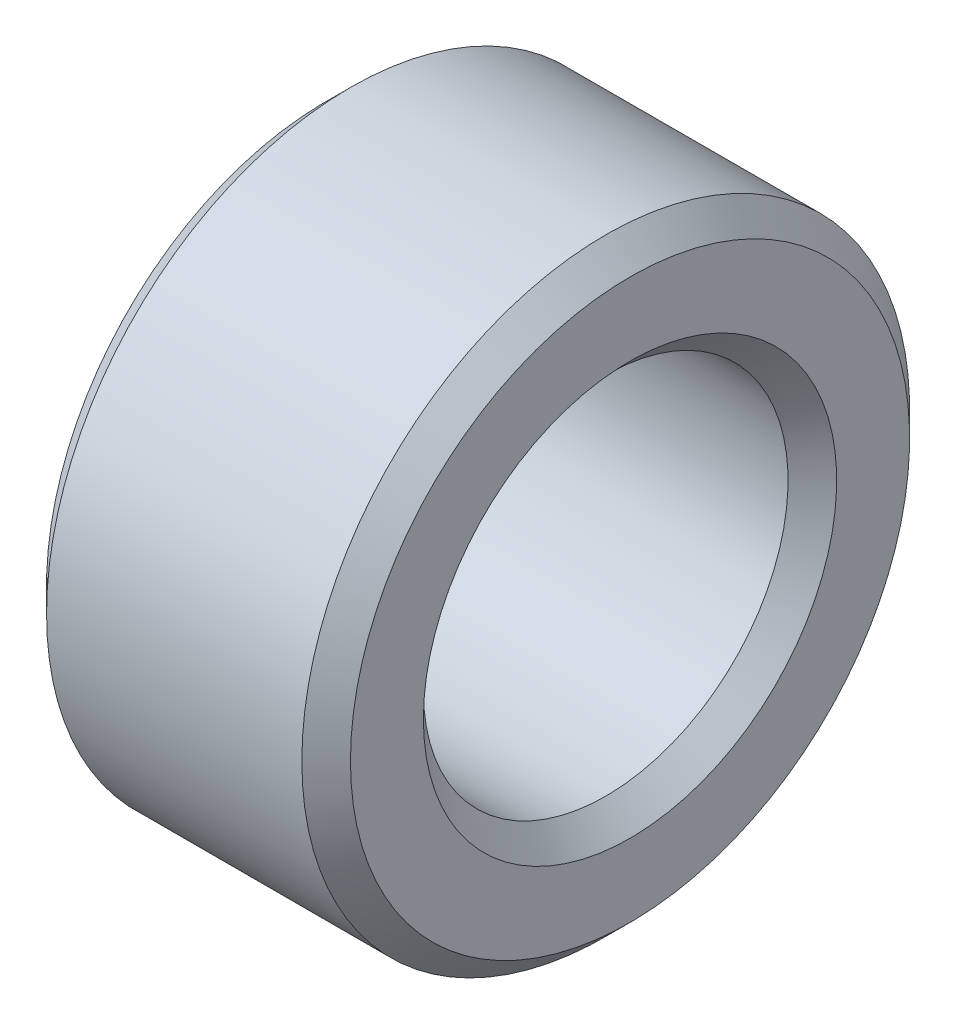
ISO-10303-21;
HEADER;
FILE_DESCRIPTION(('STEP AP214'),'2;1');
FILE_NAME('part.step','',(''),(''),'','','');
FILE_SCHEMA(('AUTOMOTIVE_DESIGN { 1 0 10303 214 1 1 1 1 }'));
ENDSEC;
DATA;
#1=APPLICATION_CONTEXT('core data for automotive mechanical design processes');
#2=APPLICATION_PROTOCOL_DEFINITION('international standard','automotive_design',2000,#1);
#3=PRODUCT_CONTEXT('',#1,'mechanical');
#4=PRODUCT('Part','Part','',(#3));
#5=PRODUCT_RELATED_PRODUCT_CATEGORY('part','',(#4));
#6=PRODUCT_DEFINITION_FORMATION('','',#4);
#7=PRODUCT_DEFINITION_CONTEXT('part definition',#1,'design');
#8=PRODUCT_DEFINITION('design','',#6,#7);
#9=PRODUCT_DEFINITION_SHAPE('','',#8);
#10=(LENGTH_UNIT() NAMED_UNIT(*) SI_UNIT(.MILLI.,.METRE.));
#11=(NAMED_UNIT(*) PLANE_ANGLE_UNIT() SI_UNIT($,.RADIAN.));
#12=(NAMED_UNIT(*) SI_UNIT($,.STERADIAN.) SOLID_ANGLE_UNIT());
#13=UNCERTAINTY_MEASURE_WITH_UNIT(LENGTH_MEASURE(1.E-05),#10,'distance_accuracy_value','');
#14=(GEOMETRIC_REPRESENTATION_CONTEXT(3) GLOBAL_UNCERTAINTY_ASSIGNED_CONTEXT((#13)) GLOBAL_UNIT_ASSIGNED_CONTEXT((#10,
#11,#12)) REPRESENTATION_CONTEXT('',''));
#15=CARTESIAN_POINT('',(0.,0.,0.));
#16=DIRECTION('',(0.,0.,1.));
#17=DIRECTION('',(1.,0.,0.));
#18=AXIS2_PLACEMENT_3D('',#15,#16,#17);
#19=CARTESIAN_POINT('',(0.,1.5,0.));
#20=DIRECTION('',(1.,0.,0.));
#21=DIRECTION('',(0.,0.,-1.));
#22=AXIS2_PLACEMENT_3D('',#19,#20,#21);
#23=PLANE('',#22);
#24=CARTESIAN_POINT('',(0.,0.,0.));
#25=DIRECTION('',(1.,0.,0.));
#26=DIRECTION('',(0.,0.,-1.));
#27=AXIS2_PLACEMENT_3D('',#24,#25,#26);
#28=CIRCLE('',#27,1.7);
#29=CARTESIAN_POINT('',(0.,0.,-1.7));
#30=VERTEX_POINT('',#29);
#31=EDGE_CURVE('E51',#30,#30,#28,.T.);
#32=ORIENTED_EDGE('',*,*,#31,.T.);
#33=EDGE_LOOP('',(#32));
#34=FACE_BOUND('',#33,.T.);
#35=CARTESIAN_POINT('',(0.,0.,0.));
#36=DIRECTION('',(1.,0.,0.));
#37=DIRECTION('',(0.,0.,-1.));
#38=AXIS2_PLACEMENT_3D('',#35,#36,#37);
#39=CIRCLE('',#38,2.3);
#40=CARTESIAN_POINT('',(0.,0.,-2.3));
#41=VERTEX_POINT('',#40);
#42=EDGE_CURVE('E54',#41,#41,#39,.F.);
#43=ORIENTED_EDGE('',*,*,#42,.T.);
#44=EDGE_LOOP('',(#43));
#45=FACE_BOUND('',#44,.T.);
#46=ADVANCED_FACE('F31',(#34,#45),#23,.F.);
#47=CARTESIAN_POINT('',(0.,0.,0.));
#48=DIRECTION('',(-1.,0.,0.));
#49=DIRECTION('',(0.,0.,1.));
#50=AXIS2_PLACEMENT_3D('',#47,#48,#49);
#51=CYLINDRICAL_SURFACE('',#50,2.5);
#52=CARTESIAN_POINT('',(0.200000000000001,0.,0.));
#53=DIRECTION('',(1.,0.,0.));
#54=DIRECTION('',(0.,0.,-1.));
#55=AXIS2_PLACEMENT_3D('',#52,#53,#54);
#56=CIRCLE('',#55,2.5);
#57=CARTESIAN_POINT('',(0.200000000000001,0.,-2.5));
#58=VERTEX_POINT('',#57);
#59=EDGE_CURVE('E42',#58,#58,#56,.T.);
#60=ORIENTED_EDGE('',*,*,#59,.T.);
#61=EDGE_LOOP('',(#60));
#62=FACE_BOUND('',#61,.T.);
#63=CARTESIAN_POINT('',(2.3,0.,0.));
#64=DIRECTION('',(-1.,0.,0.));
#65=DIRECTION('',(0.,0.,1.));
#66=AXIS2_PLACEMENT_3D('',#63,#64,#65);
#67=CIRCLE('',#66,2.5);
#68=CARTESIAN_POINT('',(2.3,0.,2.5));
#69=VERTEX_POINT('',#68);
#70=EDGE_CURVE('E46',#69,#69,#67,.T.);
#71=ORIENTED_EDGE('',*,*,#70,.T.);
#72=EDGE_LOOP('',(#71));
#73=FACE_BOUND('',#72,.T.);
#74=ADVANCED_FACE('F79',(#62,#73),#51,.T.);
#75=CARTESIAN_POINT('',(2.5,1.5,0.));
#76=DIRECTION('',(-1.,0.,0.));
#77=DIRECTION('',(0.,0.,1.));
#78=AXIS2_PLACEMENT_3D('',#75,#76,#77);
#79=PLANE('',#78);
#80=CARTESIAN_POINT('',(2.5,0.,0.));
#81=DIRECTION('',(-1.,0.,0.));
#82=DIRECTION('',(0.,0.,1.));
#83=AXIS2_PLACEMENT_3D('',#80,#81,#82);
#84=CIRCLE('',#83,1.7);
#85=CARTESIAN_POINT('',(2.5,0.,1.7));
#86=VERTEX_POINT('',#85);
#87=EDGE_CURVE('E10',#86,#86,#84,.T.);
#88=ORIENTED_EDGE('',*,*,#87,.T.);
#89=EDGE_LOOP('',(#88));
#90=FACE_BOUND('',#89,.T.);
#91=CARTESIAN_POINT('',(2.5,0.,0.));
#92=DIRECTION('',(-1.,0.,0.));
#93=DIRECTION('',(0.,0.,1.));
#94=AXIS2_PLACEMENT_3D('',#91,#92,#93);
#95=CIRCLE('',#94,2.3);
#96=CARTESIAN_POINT('',(2.5,0.,2.3));
#97=VERTEX_POINT('',#96);
#98=EDGE_CURVE('E38',#97,#97,#95,.F.);
#99=ORIENTED_EDGE('',*,*,#98,.T.);
#100=EDGE_LOOP('',(#99));
#101=FACE_BOUND('',#100,.T.);
#102=ADVANCED_FACE('F85',(#90,#101),#79,.F.);
#103=CARTESIAN_POINT('',(0.,0.,0.));
#104=DIRECTION('',(-1.,0.,0.));
#105=DIRECTION('',(0.,0.,1.));
#106=AXIS2_PLACEMENT_3D('',#103,#104,#105);
#107=CYLINDRICAL_SURFACE('',#106,1.5);
#108=CARTESIAN_POINT('',(0.200000000000001,0.,0.));
#109=DIRECTION('',(1.,0.,0.));
#110=DIRECTION('',(0.,0.,-1.));
#111=AXIS2_PLACEMENT_3D('',#108,#109,#110);
#112=CIRCLE('',#111,1.5);
#113=CARTESIAN_POINT('',(0.200000000000001,0.,-1.5));
#114=VERTEX_POINT('',#113);
#115=EDGE_CURVE('E57',#114,#114,#112,.F.);
#116=ORIENTED_EDGE('',*,*,#115,.T.);
#117=EDGE_LOOP('',(#116));
#118=FACE_BOUND('',#117,.T.);
#119=CARTESIAN_POINT('',(2.3,0.,0.));
#120=DIRECTION('',(-1.,0.,0.));
#121=DIRECTION('',(0.,0.,1.));
#122=AXIS2_PLACEMENT_3D('',#119,#120,#121);
#123=CIRCLE('',#122,1.5);
#124=CARTESIAN_POINT('',(2.3,0.,1.5));
#125=VERTEX_POINT('',#124);
#126=EDGE_CURVE('E60',#125,#125,#123,.F.);
#127=ORIENTED_EDGE('',*,*,#126,.T.);
#128=EDGE_LOOP('',(#127));
#129=FACE_BOUND('',#128,.T.);
#130=ADVANCED_FACE('F64',(#118,#129),#107,.F.);
#131=CARTESIAN_POINT('',(0.200000000000001,0.,0.));
#132=DIRECTION('',(-1.,0.,0.));
#133=DIRECTION('',(0.,0.,1.));
#134=AXIS2_PLACEMENT_3D('',#131,#132,#133);
#135=CONICAL_SURFACE('',#134,1.5,0.785398163397451);
#136=ORIENTED_EDGE('',*,*,#31,.F.);
#137=EDGE_LOOP('',(#136));
#138=FACE_BOUND('',#137,.T.);
#139=ORIENTED_EDGE('',*,*,#115,.F.);
#140=EDGE_LOOP('',(#139));
#141=FACE_BOUND('',#140,.T.);
#142=ADVANCED_FACE('F75',(#138,#141),#135,.F.);
#143=CARTESIAN_POINT('',(0.,0.,0.));
#144=DIRECTION('',(1.,0.,0.));
#145=DIRECTION('',(0.,0.,-1.));
#146=AXIS2_PLACEMENT_3D('',#143,#144,#145);
#147=CONICAL_SURFACE('',#146,2.3,0.785398163397445);
#148=ORIENTED_EDGE('',*,*,#59,.F.);
#149=EDGE_LOOP('',(#148));
#150=FACE_BOUND('',#149,.T.);
#151=ORIENTED_EDGE('',*,*,#42,.F.);
#152=EDGE_LOOP('',(#151));
#153=FACE_BOUND('',#152,.T.);
#154=ADVANCED_FACE('F69',(#150,#153),#147,.T.);
#155=CARTESIAN_POINT('',(2.5,0.,0.));
#156=DIRECTION('',(1.,0.,0.));
#157=DIRECTION('',(0.,0.,-1.));
#158=AXIS2_PLACEMENT_3D('',#155,#156,#157);
#159=CONICAL_SURFACE('',#158,1.7,0.785398163397447);
#160=ORIENTED_EDGE('',*,*,#126,.F.);
#161=EDGE_LOOP('',(#160));
#162=FACE_BOUND('',#161,.T.);
#163=ORIENTED_EDGE('',*,*,#87,.F.);
#164=EDGE_LOOP('',(#163));
#165=FACE_BOUND('',#164,.T.);
#166=ADVANCED_FACE('F66',(#162,#165),#159,.F.);
#167=CARTESIAN_POINT('',(2.3,0.,0.));
#168=DIRECTION('',(-1.,0.,0.));
#169=DIRECTION('',(0.,0.,1.));
#170=AXIS2_PLACEMENT_3D('',#167,#168,#169);
#171=CONICAL_SURFACE('',#170,2.5,0.785398163397449);
#172=ORIENTED_EDGE('',*,*,#98,.F.);
#173=EDGE_LOOP('',(#172));
#174=FACE_BOUND('',#173,.T.);
#175=ORIENTED_EDGE('',*,*,#70,.F.);
#176=EDGE_LOOP('',(#175));
#177=FACE_BOUND('',#176,.T.);
#178=ADVANCED_FACE('F33',(#174,#177),#171,.T.);
#179=CLOSED_SHELL('',(#46,#74,#102,#130,#142,#154,#166,#178));
#180=MANIFOLD_SOLID_BREP('B2',#179);
#181=ADVANCED_BREP_SHAPE_REPRESENTATION('',(#18,#180),#14);
#182=SHAPE_DEFINITION_REPRESENTATION(#9,#181);
ENDSEC;
END-ISO-10303-21;
